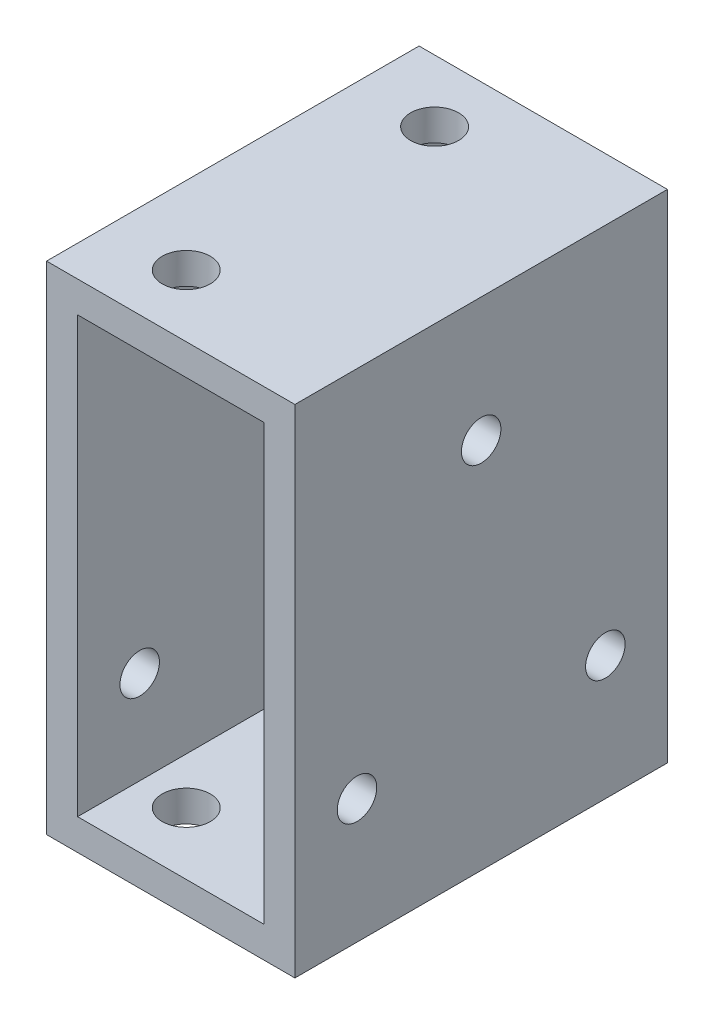
ISO-10303-21;
HEADER;
FILE_DESCRIPTION(('STEP AP214'),'2;1');
FILE_NAME('part.step','',(''),(''),'','','');
FILE_SCHEMA(('AUTOMOTIVE_DESIGN { 1 0 10303 214 1 1 1 1 }'));
ENDSEC;
DATA;
#1=APPLICATION_CONTEXT('core data for automotive mechanical design processes');
#2=APPLICATION_PROTOCOL_DEFINITION('international standard','automotive_design',2000,#1);
#3=PRODUCT_CONTEXT('',#1,'mechanical');
#4=PRODUCT('Part','Part','',(#3));
#5=PRODUCT_RELATED_PRODUCT_CATEGORY('part','',(#4));
#6=PRODUCT_DEFINITION_FORMATION('','',#4);
#7=PRODUCT_DEFINITION_CONTEXT('part definition',#1,'design');
#8=PRODUCT_DEFINITION('design','',#6,#7);
#9=PRODUCT_DEFINITION_SHAPE('','',#8);
#10=(LENGTH_UNIT() NAMED_UNIT(*) SI_UNIT(.MILLI.,.METRE.));
#11=(NAMED_UNIT(*) PLANE_ANGLE_UNIT() SI_UNIT($,.RADIAN.));
#12=(NAMED_UNIT(*) SI_UNIT($,.STERADIAN.) SOLID_ANGLE_UNIT());
#13=UNCERTAINTY_MEASURE_WITH_UNIT(LENGTH_MEASURE(1.E-05),#10,'distance_accuracy_value','');
#14=(GEOMETRIC_REPRESENTATION_CONTEXT(3) GLOBAL_UNCERTAINTY_ASSIGNED_CONTEXT((#13)) GLOBAL_UNIT_ASSIGNED_CONTEXT((#10,
#11,#12)) REPRESENTATION_CONTEXT('',''));
#15=CARTESIAN_POINT('',(0.,0.,0.));
#16=DIRECTION('',(0.,0.,1.));
#17=DIRECTION('',(1.,0.,0.));
#18=AXIS2_PLACEMENT_3D('',#15,#16,#17);
#19=CARTESIAN_POINT('',(0.,0.,19.05));
#20=DIRECTION('',(0.,0.,1.));
#21=DIRECTION('',(1.,0.,0.));
#22=AXIS2_PLACEMENT_3D('',#19,#20,#21);
#23=PLANE('',#22);
#24=DIRECTION('',(0.,1.,0.));
#25=VECTOR('',#24,1.);
#26=CARTESIAN_POINT('',(12.7,25.4,19.05));
#27=LINE('',#26,#25);
#28=CARTESIAN_POINT('',(12.7,-25.4,19.05));
#29=VERTEX_POINT('',#28);
#30=CARTESIAN_POINT('',(12.7,25.4,19.05));
#31=VERTEX_POINT('',#30);
#32=EDGE_CURVE('E138',#29,#31,#27,.T.);
#33=ORIENTED_EDGE('',*,*,#32,.T.);
#34=DIRECTION('',(-1.,0.,0.));
#35=VECTOR('',#34,1.);
#36=CARTESIAN_POINT('',(-12.7,25.4,19.05));
#37=LINE('',#36,#35);
#38=CARTESIAN_POINT('',(-12.7,25.4,19.05));
#39=VERTEX_POINT('',#38);
#40=EDGE_CURVE('E141',#31,#39,#37,.T.);
#41=ORIENTED_EDGE('',*,*,#40,.T.);
#42=DIRECTION('',(0.,-1.,0.));
#43=VECTOR('',#42,1.);
#44=CARTESIAN_POINT('',(-12.7,25.4,19.05));
#45=LINE('',#44,#43);
#46=CARTESIAN_POINT('',(-12.7,-25.4,19.05));
#47=VERTEX_POINT('',#46);
#48=EDGE_CURVE('E144',#39,#47,#45,.T.);
#49=ORIENTED_EDGE('',*,*,#48,.T.);
#50=DIRECTION('',(1.,0.,0.));
#51=VECTOR('',#50,1.);
#52=CARTESIAN_POINT('',(-12.7,-25.4,19.05));
#53=LINE('',#52,#51);
#54=EDGE_CURVE('E146',#47,#29,#53,.T.);
#55=ORIENTED_EDGE('',*,*,#54,.T.);
#56=EDGE_LOOP('',(#33,#41,#49,#55));
#57=FACE_BOUND('',#56,.T.);
#58=DIRECTION('',(1.,0.,0.));
#59=VECTOR('',#58,1.);
#60=CARTESIAN_POINT('',(-9.525,-22.225,19.05));
#61=LINE('',#60,#59);
#62=CARTESIAN_POINT('',(-9.525,-22.225,19.05));
#63=VERTEX_POINT('',#62);
#64=CARTESIAN_POINT('',(9.525,-22.225,19.05));
#65=VERTEX_POINT('',#64);
#66=EDGE_CURVE('E108',#63,#65,#61,.T.);
#67=ORIENTED_EDGE('',*,*,#66,.F.);
#68=DIRECTION('',(0.,-1.,0.));
#69=VECTOR('',#68,1.);
#70=CARTESIAN_POINT('',(-9.525,22.225,19.05));
#71=LINE('',#70,#69);
#72=CARTESIAN_POINT('',(-9.525,22.225,19.05));
#73=VERTEX_POINT('',#72);
#74=EDGE_CURVE('E100',#73,#63,#71,.T.);
#75=ORIENTED_EDGE('',*,*,#74,.F.);
#76=DIRECTION('',(-1.,0.,0.));
#77=VECTOR('',#76,1.);
#78=CARTESIAN_POINT('',(-9.525,22.225,19.05));
#79=LINE('',#78,#77);
#80=CARTESIAN_POINT('',(9.525,22.225,19.05));
#81=VERTEX_POINT('',#80);
#82=EDGE_CURVE('E122',#81,#73,#79,.T.);
#83=ORIENTED_EDGE('',*,*,#82,.F.);
#84=DIRECTION('',(0.,1.,0.));
#85=VECTOR('',#84,1.);
#86=CARTESIAN_POINT('',(9.525,22.225,19.05));
#87=LINE('',#86,#85);
#88=EDGE_CURVE('E120',#65,#81,#87,.T.);
#89=ORIENTED_EDGE('',*,*,#88,.F.);
#90=EDGE_LOOP('',(#67,#75,#83,#89));
#91=FACE_BOUND('',#90,.T.);
#92=ADVANCED_FACE('F33',(#57,#91),#23,.T.);
#93=CARTESIAN_POINT('',(0.,0.,-19.05));
#94=DIRECTION('',(0.,0.,1.));
#95=DIRECTION('',(1.,0.,0.));
#96=AXIS2_PLACEMENT_3D('',#93,#94,#95);
#97=PLANE('',#96);
#98=DIRECTION('',(0.,1.,0.));
#99=VECTOR('',#98,1.);
#100=CARTESIAN_POINT('',(12.7,25.4,-19.05));
#101=LINE('',#100,#99);
#102=CARTESIAN_POINT('',(12.7,-25.4,-19.05));
#103=VERTEX_POINT('',#102);
#104=CARTESIAN_POINT('',(12.7,25.4,-19.05));
#105=VERTEX_POINT('',#104);
#106=EDGE_CURVE('E116',#103,#105,#101,.T.);
#107=ORIENTED_EDGE('',*,*,#106,.F.);
#108=DIRECTION('',(1.,0.,0.));
#109=VECTOR('',#108,1.);
#110=CARTESIAN_POINT('',(-12.7,-25.4,-19.05));
#111=LINE('',#110,#109);
#112=CARTESIAN_POINT('',(-12.7,-25.4,-19.05));
#113=VERTEX_POINT('',#112);
#114=EDGE_CURVE('E142',#113,#103,#111,.T.);
#115=ORIENTED_EDGE('',*,*,#114,.F.);
#116=DIRECTION('',(0.,-1.,0.));
#117=VECTOR('',#116,1.);
#118=CARTESIAN_POINT('',(-12.7,25.4,-19.05));
#119=LINE('',#118,#117);
#120=CARTESIAN_POINT('',(-12.7,25.4,-19.05));
#121=VERTEX_POINT('',#120);
#122=EDGE_CURVE('E153',#121,#113,#119,.T.);
#123=ORIENTED_EDGE('',*,*,#122,.F.);
#124=DIRECTION('',(-1.,0.,0.));
#125=VECTOR('',#124,1.);
#126=CARTESIAN_POINT('',(-12.7,25.4,-19.05));
#127=LINE('',#126,#125);
#128=EDGE_CURVE('E151',#105,#121,#127,.T.);
#129=ORIENTED_EDGE('',*,*,#128,.F.);
#130=EDGE_LOOP('',(#107,#115,#123,#129));
#131=FACE_BOUND('',#130,.T.);
#132=DIRECTION('',(0.,-1.,0.));
#133=VECTOR('',#132,1.);
#134=CARTESIAN_POINT('',(-9.525,22.225,-19.05));
#135=LINE('',#134,#133);
#136=CARTESIAN_POINT('',(-9.525,22.225,-19.05));
#137=VERTEX_POINT('',#136);
#138=CARTESIAN_POINT('',(-9.525,-22.225,-19.05));
#139=VERTEX_POINT('',#138);
#140=EDGE_CURVE('E58',#137,#139,#135,.T.);
#141=ORIENTED_EDGE('',*,*,#140,.T.);
#142=DIRECTION('',(1.,0.,0.));
#143=VECTOR('',#142,1.);
#144=CARTESIAN_POINT('',(-9.525,-22.225,-19.05));
#145=LINE('',#144,#143);
#146=CARTESIAN_POINT('',(9.525,-22.225,-19.05));
#147=VERTEX_POINT('',#146);
#148=EDGE_CURVE('E115',#139,#147,#145,.T.);
#149=ORIENTED_EDGE('',*,*,#148,.T.);
#150=DIRECTION('',(0.,1.,0.));
#151=VECTOR('',#150,1.);
#152=CARTESIAN_POINT('',(9.525,22.225,-19.05));
#153=LINE('',#152,#151);
#154=CARTESIAN_POINT('',(9.525,22.225,-19.05));
#155=VERTEX_POINT('',#154);
#156=EDGE_CURVE('E130',#147,#155,#153,.T.);
#157=ORIENTED_EDGE('',*,*,#156,.T.);
#158=DIRECTION('',(-1.,0.,0.));
#159=VECTOR('',#158,1.);
#160=CARTESIAN_POINT('',(-9.525,22.225,-19.05));
#161=LINE('',#160,#159);
#162=EDGE_CURVE('E109',#155,#137,#161,.T.);
#163=ORIENTED_EDGE('',*,*,#162,.T.);
#164=EDGE_LOOP('',(#141,#149,#157,#163));
#165=FACE_BOUND('',#164,.T.);
#166=ADVANCED_FACE('F222',(#131,#165),#97,.F.);
#167=CARTESIAN_POINT('',(12.7,25.4,19.05));
#168=DIRECTION('',(-1.,0.,0.));
#169=DIRECTION('',(0.,-1.,0.));
#170=AXIS2_PLACEMENT_3D('',#167,#168,#169);
#171=PLANE('',#170);
#172=CARTESIAN_POINT('',(12.7,-12.7,-12.7));
#173=DIRECTION('',(-1.,0.,0.));
#174=DIRECTION('',(0.,0.,1.));
#175=AXIS2_PLACEMENT_3D('',#172,#173,#174);
#176=CIRCLE('',#175,2.0193);
#177=CARTESIAN_POINT('',(12.7,-12.7,-10.6807));
#178=VERTEX_POINT('',#177);
#179=EDGE_CURVE('E304',#178,#178,#176,.T.);
#180=ORIENTED_EDGE('',*,*,#179,.T.);
#181=EDGE_LOOP('',(#180));
#182=FACE_BOUND('',#181,.T.);
#183=CARTESIAN_POINT('',(12.7,-12.7,12.7));
#184=DIRECTION('',(-1.,0.,0.));
#185=DIRECTION('',(0.,0.,1.));
#186=AXIS2_PLACEMENT_3D('',#183,#184,#185);
#187=CIRCLE('',#186,2.0193);
#188=CARTESIAN_POINT('',(12.7,-12.7,14.7193));
#189=VERTEX_POINT('',#188);
#190=EDGE_CURVE('E316',#189,#189,#187,.T.);
#191=ORIENTED_EDGE('',*,*,#190,.T.);
#192=EDGE_LOOP('',(#191));
#193=FACE_BOUND('',#192,.T.);
#194=CARTESIAN_POINT('',(12.7,12.7,0.));
#195=DIRECTION('',(-1.,0.,0.));
#196=DIRECTION('',(0.,0.,1.));
#197=AXIS2_PLACEMENT_3D('',#194,#195,#196);
#198=CIRCLE('',#197,2.0193);
#199=CARTESIAN_POINT('',(12.7,12.7,2.0193));
#200=VERTEX_POINT('',#199);
#201=EDGE_CURVE('E174',#200,#200,#198,.T.);
#202=ORIENTED_EDGE('',*,*,#201,.T.);
#203=EDGE_LOOP('',(#202));
#204=FACE_BOUND('',#203,.T.);
#205=ORIENTED_EDGE('',*,*,#106,.T.);
#206=DIRECTION('',(0.,0.,-1.));
#207=VECTOR('',#206,1.);
#208=CARTESIAN_POINT('',(12.7,25.4,19.05));
#209=LINE('',#208,#207);
#210=EDGE_CURVE('E11',#31,#105,#209,.T.);
#211=ORIENTED_EDGE('',*,*,#210,.F.);
#212=ORIENTED_EDGE('',*,*,#32,.F.);
#213=DIRECTION('',(0.,0.,-1.));
#214=VECTOR('',#213,1.);
#215=CARTESIAN_POINT('',(12.7,-25.4,19.05));
#216=LINE('',#215,#214);
#217=EDGE_CURVE('E148',#29,#103,#216,.T.);
#218=ORIENTED_EDGE('',*,*,#217,.T.);
#219=EDGE_LOOP('',(#205,#211,#212,#218));
#220=FACE_BOUND('',#219,.T.);
#221=ADVANCED_FACE('F35',(#182,#193,#204,#220),#171,.F.);
#222=CARTESIAN_POINT('',(-12.7,25.4,19.05));
#223=DIRECTION('',(0.,-1.,0.));
#224=DIRECTION('',(0.,0.,-1.));
#225=AXIS2_PLACEMENT_3D('',#222,#223,#224);
#226=PLANE('',#225);
#227=CARTESIAN_POINT('',(-4.7625,25.4,12.7));
#228=DIRECTION('',(0.,1.,0.));
#229=DIRECTION('',(0.,0.,1.));
#230=AXIS2_PLACEMENT_3D('',#227,#228,#229);
#231=CIRCLE('',#230,2.45745);
#232=CARTESIAN_POINT('',(-4.7625,25.4,15.15745));
#233=VERTEX_POINT('',#232);
#234=EDGE_CURVE('E178',#233,#233,#231,.T.);
#235=ORIENTED_EDGE('',*,*,#234,.F.);
#236=EDGE_LOOP('',(#235));
#237=FACE_BOUND('',#236,.T.);
#238=CARTESIAN_POINT('',(-4.76250000000001,25.4,-12.7));
#239=DIRECTION('',(0.,1.,0.));
#240=DIRECTION('',(0.,0.,1.));
#241=AXIS2_PLACEMENT_3D('',#238,#239,#240);
#242=CIRCLE('',#241,2.45745);
#243=CARTESIAN_POINT('',(-4.76250000000001,25.4,-10.24255));
#244=VERTEX_POINT('',#243);
#245=EDGE_CURVE('E196',#244,#244,#242,.T.);
#246=ORIENTED_EDGE('',*,*,#245,.F.);
#247=EDGE_LOOP('',(#246));
#248=FACE_BOUND('',#247,.T.);
#249=ORIENTED_EDGE('',*,*,#128,.T.);
#250=DIRECTION('',(0.,0.,-1.));
#251=VECTOR('',#250,1.);
#252=CARTESIAN_POINT('',(-12.7,25.4,19.05));
#253=LINE('',#252,#251);
#254=EDGE_CURVE('E42',#39,#121,#253,.T.);
#255=ORIENTED_EDGE('',*,*,#254,.F.);
#256=ORIENTED_EDGE('',*,*,#40,.F.);
#257=ORIENTED_EDGE('',*,*,#210,.T.);
#258=EDGE_LOOP('',(#249,#255,#256,#257));
#259=FACE_BOUND('',#258,.T.);
#260=ADVANCED_FACE('F236',(#237,#248,#259),#226,.F.);
#261=CARTESIAN_POINT('',(-12.7,25.4,19.05));
#262=DIRECTION('',(1.,0.,0.));
#263=DIRECTION('',(0.,1.,0.));
#264=AXIS2_PLACEMENT_3D('',#261,#262,#263);
#265=PLANE('',#264);
#266=CARTESIAN_POINT('',(-12.7,-12.7,-12.7));
#267=DIRECTION('',(-1.,0.,0.));
#268=DIRECTION('',(0.,0.,1.));
#269=AXIS2_PLACEMENT_3D('',#266,#267,#268);
#270=CIRCLE('',#269,2.01929999999999);
#271=CARTESIAN_POINT('',(-12.7,-12.7,-10.6807));
#272=VERTEX_POINT('',#271);
#273=EDGE_CURVE('E305',#272,#272,#270,.T.);
#274=ORIENTED_EDGE('',*,*,#273,.F.);
#275=EDGE_LOOP('',(#274));
#276=FACE_BOUND('',#275,.T.);
#277=CARTESIAN_POINT('',(-12.7,-12.7,12.7));
#278=DIRECTION('',(-1.,0.,0.));
#279=DIRECTION('',(0.,0.,1.));
#280=AXIS2_PLACEMENT_3D('',#277,#278,#279);
#281=CIRCLE('',#280,2.01929999999999);
#282=CARTESIAN_POINT('',(-12.7,-12.7,14.7193));
#283=VERTEX_POINT('',#282);
#284=EDGE_CURVE('E313',#283,#283,#281,.T.);
#285=ORIENTED_EDGE('',*,*,#284,.F.);
#286=EDGE_LOOP('',(#285));
#287=FACE_BOUND('',#286,.T.);
#288=CARTESIAN_POINT('',(-12.7,12.7,0.));
#289=DIRECTION('',(-1.,0.,0.));
#290=DIRECTION('',(0.,0.,1.));
#291=AXIS2_PLACEMENT_3D('',#288,#289,#290);
#292=CIRCLE('',#291,2.01929999999999);
#293=CARTESIAN_POINT('',(-12.7,12.7,2.01929999999999));
#294=VERTEX_POINT('',#293);
#295=EDGE_CURVE('E181',#294,#294,#292,.T.);
#296=ORIENTED_EDGE('',*,*,#295,.F.);
#297=EDGE_LOOP('',(#296));
#298=FACE_BOUND('',#297,.T.);
#299=ORIENTED_EDGE('',*,*,#122,.T.);
#300=DIRECTION('',(0.,0.,-1.));
#301=VECTOR('',#300,1.);
#302=CARTESIAN_POINT('',(-12.7,-25.4,19.05));
#303=LINE('',#302,#301);
#304=EDGE_CURVE('E158',#47,#113,#303,.T.);
#305=ORIENTED_EDGE('',*,*,#304,.F.);
#306=ORIENTED_EDGE('',*,*,#48,.F.);
#307=ORIENTED_EDGE('',*,*,#254,.T.);
#308=EDGE_LOOP('',(#299,#305,#306,#307));
#309=FACE_BOUND('',#308,.T.);
#310=ADVANCED_FACE('F233',(#276,#287,#298,#309),#265,.F.);
#311=CARTESIAN_POINT('',(-12.7,-25.4,19.05));
#312=DIRECTION('',(0.,1.,0.));
#313=DIRECTION('',(0.,0.,1.));
#314=AXIS2_PLACEMENT_3D('',#311,#312,#313);
#315=PLANE('',#314);
#316=CARTESIAN_POINT('',(-4.7625,-25.4,12.7));
#317=DIRECTION('',(0.,1.,0.));
#318=DIRECTION('',(0.,0.,1.));
#319=AXIS2_PLACEMENT_3D('',#316,#317,#318);
#320=CIRCLE('',#319,2.45744999999999);
#321=CARTESIAN_POINT('',(-4.7625,-25.4,15.15745));
#322=VERTEX_POINT('',#321);
#323=EDGE_CURVE('E170',#322,#322,#320,.T.);
#324=ORIENTED_EDGE('',*,*,#323,.T.);
#325=EDGE_LOOP('',(#324));
#326=FACE_BOUND('',#325,.T.);
#327=CARTESIAN_POINT('',(-4.76250000000001,-25.4,-12.7));
#328=DIRECTION('',(0.,1.,0.));
#329=DIRECTION('',(0.,0.,1.));
#330=AXIS2_PLACEMENT_3D('',#327,#328,#329);
#331=CIRCLE('',#330,2.45744999999999);
#332=CARTESIAN_POINT('',(-4.76250000000001,-25.4,-10.24255));
#333=VERTEX_POINT('',#332);
#334=EDGE_CURVE('E166',#333,#333,#331,.T.);
#335=ORIENTED_EDGE('',*,*,#334,.T.);
#336=EDGE_LOOP('',(#335));
#337=FACE_BOUND('',#336,.T.);
#338=ORIENTED_EDGE('',*,*,#114,.T.);
#339=ORIENTED_EDGE('',*,*,#217,.F.);
#340=ORIENTED_EDGE('',*,*,#54,.F.);
#341=ORIENTED_EDGE('',*,*,#304,.T.);
#342=EDGE_LOOP('',(#338,#339,#340,#341));
#343=FACE_BOUND('',#342,.T.);
#344=ADVANCED_FACE('F217',(#326,#337,#343),#315,.F.);
#345=CARTESIAN_POINT('',(-9.525,22.225,19.05));
#346=DIRECTION('',(1.,0.,0.));
#347=DIRECTION('',(0.,0.,-1.));
#348=AXIS2_PLACEMENT_3D('',#345,#346,#347);
#349=PLANE('',#348);
#350=CARTESIAN_POINT('',(-9.525,-12.7,-12.7));
#351=DIRECTION('',(1.,0.,0.));
#352=DIRECTION('',(0.,0.,-1.));
#353=AXIS2_PLACEMENT_3D('',#350,#351,#352);
#354=CIRCLE('',#353,2.01929999999999);
#355=CARTESIAN_POINT('',(-9.525,-12.7,-14.7193));
#356=VERTEX_POINT('',#355);
#357=EDGE_CURVE('E307',#356,#356,#354,.T.);
#358=ORIENTED_EDGE('',*,*,#357,.F.);
#359=EDGE_LOOP('',(#358));
#360=FACE_BOUND('',#359,.T.);
#361=CARTESIAN_POINT('',(-9.525,-12.7,12.7));
#362=DIRECTION('',(1.,0.,0.));
#363=DIRECTION('',(0.,0.,-1.));
#364=AXIS2_PLACEMENT_3D('',#361,#362,#363);
#365=CIRCLE('',#364,2.01929999999999);
#366=CARTESIAN_POINT('',(-9.525,-12.7,10.6807));
#367=VERTEX_POINT('',#366);
#368=EDGE_CURVE('E319',#367,#367,#365,.T.);
#369=ORIENTED_EDGE('',*,*,#368,.F.);
#370=EDGE_LOOP('',(#369));
#371=FACE_BOUND('',#370,.T.);
#372=CARTESIAN_POINT('',(-9.525,12.7,0.));
#373=DIRECTION('',(1.,0.,0.));
#374=DIRECTION('',(0.,0.,-1.));
#375=AXIS2_PLACEMENT_3D('',#372,#373,#374);
#376=CIRCLE('',#375,2.01929999999999);
#377=CARTESIAN_POINT('',(-9.525,12.7,-2.01929999999999));
#378=VERTEX_POINT('',#377);
#379=EDGE_CURVE('E173',#378,#378,#376,.T.);
#380=ORIENTED_EDGE('',*,*,#379,.F.);
#381=EDGE_LOOP('',(#380));
#382=FACE_BOUND('',#381,.T.);
#383=ORIENTED_EDGE('',*,*,#140,.F.);
#384=DIRECTION('',(0.,0.,-1.));
#385=VECTOR('',#384,1.);
#386=CARTESIAN_POINT('',(-9.525,22.225,19.05));
#387=LINE('',#386,#385);
#388=EDGE_CURVE('E104',#73,#137,#387,.T.);
#389=ORIENTED_EDGE('',*,*,#388,.F.);
#390=ORIENTED_EDGE('',*,*,#74,.T.);
#391=DIRECTION('',(0.,0.,-1.));
#392=VECTOR('',#391,1.);
#393=CARTESIAN_POINT('',(-9.525,-22.225,19.05));
#394=LINE('',#393,#392);
#395=EDGE_CURVE('E103',#63,#139,#394,.T.);
#396=ORIENTED_EDGE('',*,*,#395,.T.);
#397=EDGE_LOOP('',(#383,#389,#390,#396));
#398=FACE_BOUND('',#397,.T.);
#399=ADVANCED_FACE('F102',(#360,#371,#382,#398),#349,.T.);
#400=CARTESIAN_POINT('',(-9.525,-22.225,19.05));
#401=DIRECTION('',(0.,1.,0.));
#402=DIRECTION('',(-1.,0.,0.));
#403=AXIS2_PLACEMENT_3D('',#400,#401,#402);
#404=PLANE('',#403);
#405=CARTESIAN_POINT('',(-4.7625,-22.225,12.7));
#406=DIRECTION('',(0.,1.,0.));
#407=DIRECTION('',(-1.,0.,0.));
#408=AXIS2_PLACEMENT_3D('',#405,#406,#407);
#409=CIRCLE('',#408,2.45744999999999);
#410=CARTESIAN_POINT('',(-7.21995,-22.225,12.7));
#411=VERTEX_POINT('',#410);
#412=EDGE_CURVE('E169',#411,#411,#409,.T.);
#413=ORIENTED_EDGE('',*,*,#412,.F.);
#414=EDGE_LOOP('',(#413));
#415=FACE_BOUND('',#414,.T.);
#416=CARTESIAN_POINT('',(-4.76250000000001,-22.225,-12.7));
#417=DIRECTION('',(0.,1.,0.));
#418=DIRECTION('',(-1.,0.,0.));
#419=AXIS2_PLACEMENT_3D('',#416,#417,#418);
#420=CIRCLE('',#419,2.45744999999999);
#421=CARTESIAN_POINT('',(-7.21995,-22.225,-12.7));
#422=VERTEX_POINT('',#421);
#423=EDGE_CURVE('E128',#422,#422,#420,.T.);
#424=ORIENTED_EDGE('',*,*,#423,.F.);
#425=EDGE_LOOP('',(#424));
#426=FACE_BOUND('',#425,.T.);
#427=ORIENTED_EDGE('',*,*,#148,.F.);
#428=ORIENTED_EDGE('',*,*,#395,.F.);
#429=ORIENTED_EDGE('',*,*,#66,.T.);
#430=DIRECTION('',(0.,0.,-1.));
#431=VECTOR('',#430,1.);
#432=CARTESIAN_POINT('',(9.525,-22.225,19.05));
#433=LINE('',#432,#431);
#434=EDGE_CURVE('E117',#65,#147,#433,.T.);
#435=ORIENTED_EDGE('',*,*,#434,.T.);
#436=EDGE_LOOP('',(#427,#428,#429,#435));
#437=FACE_BOUND('',#436,.T.);
#438=ADVANCED_FACE('F112',(#415,#426,#437),#404,.T.);
#439=CARTESIAN_POINT('',(9.525,22.225,19.05));
#440=DIRECTION('',(-1.,0.,0.));
#441=DIRECTION('',(0.,0.,1.));
#442=AXIS2_PLACEMENT_3D('',#439,#440,#441);
#443=PLANE('',#442);
#444=CARTESIAN_POINT('',(9.525,-12.7,-12.7));
#445=DIRECTION('',(-1.,0.,0.));
#446=DIRECTION('',(0.,0.,1.));
#447=AXIS2_PLACEMENT_3D('',#444,#445,#446);
#448=CIRCLE('',#447,2.01929999999999);
#449=CARTESIAN_POINT('',(9.525,-12.7,-10.6807));
#450=VERTEX_POINT('',#449);
#451=EDGE_CURVE('E37',#450,#450,#448,.T.);
#452=ORIENTED_EDGE('',*,*,#451,.F.);
#453=EDGE_LOOP('',(#452));
#454=FACE_BOUND('',#453,.T.);
#455=CARTESIAN_POINT('',(9.525,-12.7,12.7));
#456=DIRECTION('',(-1.,0.,0.));
#457=DIRECTION('',(0.,0.,1.));
#458=AXIS2_PLACEMENT_3D('',#455,#456,#457);
#459=CIRCLE('',#458,2.01929999999999);
#460=CARTESIAN_POINT('',(9.525,-12.7,14.7193));
#461=VERTEX_POINT('',#460);
#462=EDGE_CURVE('E186',#461,#461,#459,.T.);
#463=ORIENTED_EDGE('',*,*,#462,.F.);
#464=EDGE_LOOP('',(#463));
#465=FACE_BOUND('',#464,.T.);
#466=CARTESIAN_POINT('',(9.52499999999999,12.7,0.));
#467=DIRECTION('',(-1.,0.,0.));
#468=DIRECTION('',(0.,0.,1.));
#469=AXIS2_PLACEMENT_3D('',#466,#467,#468);
#470=CIRCLE('',#469,2.01929999999999);
#471=CARTESIAN_POINT('',(9.52499999999999,12.7,2.01929999999999));
#472=VERTEX_POINT('',#471);
#473=EDGE_CURVE('E171',#472,#472,#470,.T.);
#474=ORIENTED_EDGE('',*,*,#473,.F.);
#475=EDGE_LOOP('',(#474));
#476=FACE_BOUND('',#475,.T.);
#477=ORIENTED_EDGE('',*,*,#156,.F.);
#478=ORIENTED_EDGE('',*,*,#434,.F.);
#479=ORIENTED_EDGE('',*,*,#88,.T.);
#480=DIRECTION('',(0.,0.,-1.));
#481=VECTOR('',#480,1.);
#482=CARTESIAN_POINT('',(9.525,22.225,19.05));
#483=LINE('',#482,#481);
#484=EDGE_CURVE('E50',#81,#155,#483,.T.);
#485=ORIENTED_EDGE('',*,*,#484,.T.);
#486=EDGE_LOOP('',(#477,#478,#479,#485));
#487=FACE_BOUND('',#486,.T.);
#488=ADVANCED_FACE('F207',(#454,#465,#476,#487),#443,.T.);
#489=CARTESIAN_POINT('',(-9.525,22.225,19.05));
#490=DIRECTION('',(0.,-1.,0.));
#491=DIRECTION('',(0.,0.,-1.));
#492=AXIS2_PLACEMENT_3D('',#489,#490,#491);
#493=PLANE('',#492);
#494=CARTESIAN_POINT('',(-4.7625,22.225,12.7));
#495=DIRECTION('',(0.,-1.,0.));
#496=DIRECTION('',(0.,0.,-1.));
#497=AXIS2_PLACEMENT_3D('',#494,#495,#496);
#498=CIRCLE('',#497,2.45744999999999);
#499=CARTESIAN_POINT('',(-4.7625,22.225,10.24255));
#500=VERTEX_POINT('',#499);
#501=EDGE_CURVE('E167',#500,#500,#498,.T.);
#502=ORIENTED_EDGE('',*,*,#501,.F.);
#503=EDGE_LOOP('',(#502));
#504=FACE_BOUND('',#503,.T.);
#505=CARTESIAN_POINT('',(-4.76250000000001,22.225,-12.7));
#506=DIRECTION('',(0.,-1.,0.));
#507=DIRECTION('',(0.,0.,-1.));
#508=AXIS2_PLACEMENT_3D('',#505,#506,#507);
#509=CIRCLE('',#508,2.45744999999999);
#510=CARTESIAN_POINT('',(-4.76250000000001,22.225,-15.15745));
#511=VERTEX_POINT('',#510);
#512=EDGE_CURVE('E163',#511,#511,#509,.T.);
#513=ORIENTED_EDGE('',*,*,#512,.F.);
#514=EDGE_LOOP('',(#513));
#515=FACE_BOUND('',#514,.T.);
#516=ORIENTED_EDGE('',*,*,#162,.F.);
#517=ORIENTED_EDGE('',*,*,#484,.F.);
#518=ORIENTED_EDGE('',*,*,#82,.T.);
#519=ORIENTED_EDGE('',*,*,#388,.T.);
#520=EDGE_LOOP('',(#516,#517,#518,#519));
#521=FACE_BOUND('',#520,.T.);
#522=ADVANCED_FACE('F214',(#504,#515,#521),#493,.T.);
#523=CARTESIAN_POINT('',(-4.76250000000001,25.4,-12.7));
#524=DIRECTION('',(0.,1.,0.));
#525=DIRECTION('',(0.,0.,1.));
#526=AXIS2_PLACEMENT_3D('',#523,#524,#525);
#527=CYLINDRICAL_SURFACE('',#526,2.45744999999999);
#528=ORIENTED_EDGE('',*,*,#512,.T.);
#529=EDGE_LOOP('',(#528));
#530=FACE_BOUND('',#529,.T.);
#531=ORIENTED_EDGE('',*,*,#245,.T.);
#532=EDGE_LOOP('',(#531));
#533=FACE_BOUND('',#532,.T.);
#534=ADVANCED_FACE('F264',(#530,#533),#527,.F.);
#535=ORIENTED_EDGE('',*,*,#423,.T.);
#536=EDGE_LOOP('',(#535));
#537=FACE_BOUND('',#536,.T.);
#538=ORIENTED_EDGE('',*,*,#334,.F.);
#539=EDGE_LOOP('',(#538));
#540=FACE_BOUND('',#539,.T.);
#541=ADVANCED_FACE('F203',(#537,#540),#527,.F.);
#542=CARTESIAN_POINT('',(-4.7625,25.4,12.7));
#543=DIRECTION('',(0.,1.,0.));
#544=DIRECTION('',(0.,0.,1.));
#545=AXIS2_PLACEMENT_3D('',#542,#543,#544);
#546=CYLINDRICAL_SURFACE('',#545,2.45744999999999);
#547=ORIENTED_EDGE('',*,*,#501,.T.);
#548=EDGE_LOOP('',(#547));
#549=FACE_BOUND('',#548,.T.);
#550=ORIENTED_EDGE('',*,*,#234,.T.);
#551=EDGE_LOOP('',(#550));
#552=FACE_BOUND('',#551,.T.);
#553=ADVANCED_FACE('F275',(#549,#552),#546,.F.);
#554=ORIENTED_EDGE('',*,*,#412,.T.);
#555=EDGE_LOOP('',(#554));
#556=FACE_BOUND('',#555,.T.);
#557=ORIENTED_EDGE('',*,*,#323,.F.);
#558=EDGE_LOOP('',(#557));
#559=FACE_BOUND('',#558,.T.);
#560=ADVANCED_FACE('F278',(#556,#559),#546,.F.);
#561=CARTESIAN_POINT('',(-12.7,12.7,0.));
#562=DIRECTION('',(-1.,0.,0.));
#563=DIRECTION('',(0.,0.,1.));
#564=AXIS2_PLACEMENT_3D('',#561,#562,#563);
#565=CYLINDRICAL_SURFACE('',#564,2.01929999999999);
#566=ORIENTED_EDGE('',*,*,#473,.T.);
#567=EDGE_LOOP('',(#566));
#568=FACE_BOUND('',#567,.T.);
#569=ORIENTED_EDGE('',*,*,#201,.F.);
#570=EDGE_LOOP('',(#569));
#571=FACE_BOUND('',#570,.T.);
#572=ADVANCED_FACE('F280',(#568,#571),#565,.F.);
#573=ORIENTED_EDGE('',*,*,#379,.T.);
#574=EDGE_LOOP('',(#573));
#575=FACE_BOUND('',#574,.T.);
#576=ORIENTED_EDGE('',*,*,#295,.T.);
#577=EDGE_LOOP('',(#576));
#578=FACE_BOUND('',#577,.T.);
#579=ADVANCED_FACE('F283',(#575,#578),#565,.F.);
#580=CARTESIAN_POINT('',(-12.7,-12.7,12.7));
#581=DIRECTION('',(-1.,0.,0.));
#582=DIRECTION('',(0.,0.,1.));
#583=AXIS2_PLACEMENT_3D('',#580,#581,#582);
#584=CYLINDRICAL_SURFACE('',#583,2.01929999999999);
#585=ORIENTED_EDGE('',*,*,#368,.T.);
#586=EDGE_LOOP('',(#585));
#587=FACE_BOUND('',#586,.T.);
#588=ORIENTED_EDGE('',*,*,#284,.T.);
#589=EDGE_LOOP('',(#588));
#590=FACE_BOUND('',#589,.T.);
#591=ADVANCED_FACE('F284',(#587,#590),#584,.F.);
#592=ORIENTED_EDGE('',*,*,#462,.T.);
#593=EDGE_LOOP('',(#592));
#594=FACE_BOUND('',#593,.T.);
#595=ORIENTED_EDGE('',*,*,#190,.F.);
#596=EDGE_LOOP('',(#595));
#597=FACE_BOUND('',#596,.T.);
#598=ADVANCED_FACE('F287',(#594,#597),#584,.F.);
#599=CARTESIAN_POINT('',(-12.7,-12.7,-12.7));
#600=DIRECTION('',(-1.,0.,0.));
#601=DIRECTION('',(0.,0.,1.));
#602=AXIS2_PLACEMENT_3D('',#599,#600,#601);
#603=CYLINDRICAL_SURFACE('',#602,2.01929999999999);
#604=ORIENTED_EDGE('',*,*,#451,.T.);
#605=EDGE_LOOP('',(#604));
#606=FACE_BOUND('',#605,.T.);
#607=ORIENTED_EDGE('',*,*,#179,.F.);
#608=EDGE_LOOP('',(#607));
#609=FACE_BOUND('',#608,.T.);
#610=ADVANCED_FACE('F289',(#606,#609),#603,.F.);
#611=ORIENTED_EDGE('',*,*,#357,.T.);
#612=EDGE_LOOP('',(#611));
#613=FACE_BOUND('',#612,.T.);
#614=ORIENTED_EDGE('',*,*,#273,.T.);
#615=EDGE_LOOP('',(#614));
#616=FACE_BOUND('',#615,.T.);
#617=ADVANCED_FACE('F291',(#613,#616),#603,.F.);
#618=CLOSED_SHELL('',(#92,#166,#221,#260,#310,#344,#399,#438,#488,#522,#534,#541,#553,#560,#572,
#579,#591,#598,#610,#617));
#619=MANIFOLD_SOLID_BREP('B2',#618);
#620=ADVANCED_BREP_SHAPE_REPRESENTATION('',(#18,#619),#14);
#621=SHAPE_DEFINITION_REPRESENTATION(#9,#620);
ENDSEC;
END-ISO-10303-21;
